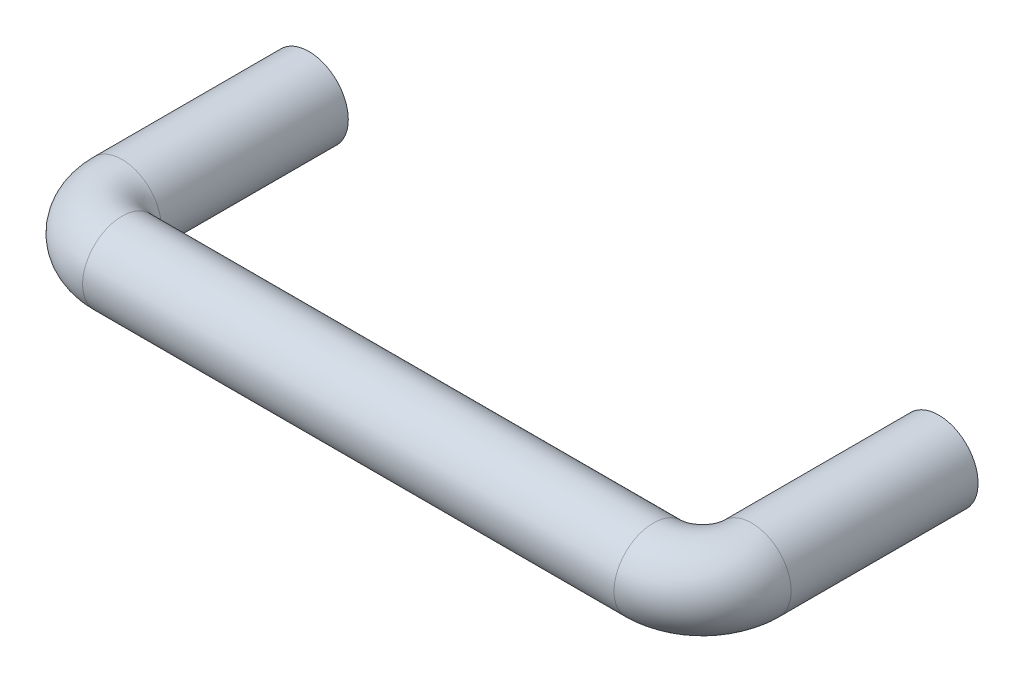
ISO-10303-21;
HEADER;
FILE_DESCRIPTION(('STEP AP214'),'2;1');
FILE_NAME('part.step','',(''),(''),'','','');
FILE_SCHEMA(('AUTOMOTIVE_DESIGN { 1 0 10303 214 1 1 1 1 }'));
ENDSEC;
DATA;
#1=APPLICATION_CONTEXT('core data for automotive mechanical design processes');
#2=APPLICATION_PROTOCOL_DEFINITION('international standard','automotive_design',2000,#1);
#3=PRODUCT_CONTEXT('',#1,'mechanical');
#4=PRODUCT('Part','Part','',(#3));
#5=PRODUCT_RELATED_PRODUCT_CATEGORY('part','',(#4));
#6=PRODUCT_DEFINITION_FORMATION('','',#4);
#7=PRODUCT_DEFINITION_CONTEXT('part definition',#1,'design');
#8=PRODUCT_DEFINITION('design','',#6,#7);
#9=PRODUCT_DEFINITION_SHAPE('','',#8);
#10=(LENGTH_UNIT() NAMED_UNIT(*) SI_UNIT(.MILLI.,.METRE.));
#11=(NAMED_UNIT(*) PLANE_ANGLE_UNIT() SI_UNIT($,.RADIAN.));
#12=(NAMED_UNIT(*) SI_UNIT($,.STERADIAN.) SOLID_ANGLE_UNIT());
#13=UNCERTAINTY_MEASURE_WITH_UNIT(LENGTH_MEASURE(1.E-05),#10,'distance_accuracy_value','');
#14=(GEOMETRIC_REPRESENTATION_CONTEXT(3) GLOBAL_UNCERTAINTY_ASSIGNED_CONTEXT((#13)) GLOBAL_UNIT_ASSIGNED_CONTEXT((#10,
#11,#12)) REPRESENTATION_CONTEXT('',''));
#15=CARTESIAN_POINT('',(0.,0.,0.));
#16=DIRECTION('',(0.,0.,1.));
#17=DIRECTION('',(1.,0.,0.));
#18=AXIS2_PLACEMENT_3D('',#15,#16,#17);
#19=CARTESIAN_POINT('',(101.6,0.,14.6812000000409));
#20=DIRECTION('',(0.,0.,-1.));
#21=DIRECTION('',(-1.,0.,0.));
#22=AXIS2_PLACEMENT_3D('',#19,#20,#21);
#23=CONICAL_SURFACE('',#22,2.55269999992916,1.02974425859277);
#24=CARTESIAN_POINT('',(101.6,0.,14.6812));
#25=DIRECTION('',(0.,0.,1.));
#26=DIRECTION('',(1.,0.,0.));
#27=AXIS2_PLACEMENT_3D('',#24,#25,#26);
#28=CIRCLE('',#27,2.5527);
#29=CARTESIAN_POINT('',(104.1527,0.,14.6812));
#30=VERTEX_POINT('',#29);
#31=EDGE_CURVE('E72',#30,#30,#28,.F.);
#32=ORIENTED_EDGE('',*,*,#31,.T.);
#33=EDGE_LOOP('',(#32));
#34=FACE_BOUND('',#33,.T.);
#35=CARTESIAN_POINT('',(101.599999999905,0.,16.2150169022652));
#36=VERTEX_POINT('',#35);
#37=VERTEX_LOOP('',#36);
#38=FACE_BOUND('',#37,.T.);
#39=ADVANCED_FACE('F16',(#34,#38),#23,.F.);
#40=CARTESIAN_POINT('',(-101.6,0.,14.6812000000978));
#41=DIRECTION('',(0.,0.,-1.));
#42=DIRECTION('',(-1.,0.,0.));
#43=AXIS2_PLACEMENT_3D('',#40,#41,#42);
#44=CONICAL_SURFACE('',#43,2.55269999989113,1.0297442585436);
#45=CARTESIAN_POINT('',(-101.6,0.,14.6812));
#46=DIRECTION('',(0.,0.,-1.));
#47=DIRECTION('',(-1.,0.,0.));
#48=AXIS2_PLACEMENT_3D('',#45,#46,#47);
#49=CIRCLE('',#48,2.5527);
#50=CARTESIAN_POINT('',(-104.1527,0.,14.6812));
#51=VERTEX_POINT('',#50);
#52=EDGE_CURVE('E69',#51,#51,#49,.T.);
#53=ORIENTED_EDGE('',*,*,#52,.T.);
#54=EDGE_LOOP('',(#53));
#55=FACE_BOUND('',#54,.T.);
#56=CARTESIAN_POINT('',(-101.599999999792,0.,16.2150169022652));
#57=VERTEX_POINT('',#56);
#58=VERTEX_LOOP('',#57);
#59=FACE_BOUND('',#58,.T.);
#60=ADVANCED_FACE('F32',(#55,#59),#44,.F.);
#61=CARTESIAN_POINT('',(101.6,0.,17.0257677473017));
#62=DIRECTION('',(0.,0.,1.));
#63=DIRECTION('',(1.,0.,0.));
#64=AXIS2_PLACEMENT_3D('',#61,#62,#63);
#65=CYLINDRICAL_SURFACE('',#64,2.5527);
#66=ORIENTED_EDGE('',*,*,#31,.F.);
#67=EDGE_LOOP('',(#66));
#68=FACE_BOUND('',#67,.T.);
#69=CARTESIAN_POINT('',(101.6,0.,0.));
#70=DIRECTION('',(0.,0.,1.));
#71=DIRECTION('',(1.,0.,0.));
#72=AXIS2_PLACEMENT_3D('',#69,#70,#71);
#73=CIRCLE('',#72,2.5527);
#74=CARTESIAN_POINT('',(104.1527,0.,0.));
#75=VERTEX_POINT('',#74);
#76=EDGE_CURVE('E19',#75,#75,#73,.T.);
#77=ORIENTED_EDGE('',*,*,#76,.F.);
#78=EDGE_LOOP('',(#77));
#79=FACE_BOUND('',#78,.T.);
#80=ADVANCED_FACE('F38',(#68,#79),#65,.F.);
#81=CARTESIAN_POINT('',(-101.6,0.,17.0257677473017));
#82=DIRECTION('',(0.,0.,-1.));
#83=DIRECTION('',(-1.,0.,0.));
#84=AXIS2_PLACEMENT_3D('',#81,#82,#83);
#85=CYLINDRICAL_SURFACE('',#84,2.5527);
#86=ORIENTED_EDGE('',*,*,#52,.F.);
#87=EDGE_LOOP('',(#86));
#88=FACE_BOUND('',#87,.T.);
#89=CARTESIAN_POINT('',(-101.6,0.,0.));
#90=DIRECTION('',(0.,0.,-1.));
#91=DIRECTION('',(-1.,0.,0.));
#92=AXIS2_PLACEMENT_3D('',#89,#90,#91);
#93=CIRCLE('',#92,2.5527);
#94=CARTESIAN_POINT('',(-104.1527,0.,0.));
#95=VERTEX_POINT('',#94);
#96=EDGE_CURVE('E78',#95,#95,#93,.T.);
#97=ORIENTED_EDGE('',*,*,#96,.T.);
#98=EDGE_LOOP('',(#97));
#99=FACE_BOUND('',#98,.T.);
#100=ADVANCED_FACE('F89',(#88,#99),#85,.F.);
#101=CARTESIAN_POINT('',(101.6,0.,0.));
#102=DIRECTION('',(0.,0.,-1.));
#103=DIRECTION('',(-1.,0.,0.));
#104=AXIS2_PLACEMENT_3D('',#101,#102,#103);
#105=PLANE('',#104);
#106=ORIENTED_EDGE('',*,*,#76,.T.);
#107=EDGE_LOOP('',(#106));
#108=FACE_BOUND('',#107,.T.);
#109=CARTESIAN_POINT('',(101.6,0.,0.));
#110=DIRECTION('',(0.,0.,-1.));
#111=DIRECTION('',(-1.,0.,0.));
#112=AXIS2_PLACEMENT_3D('',#109,#110,#111);
#113=CIRCLE('',#112,12.7);
#114=CARTESIAN_POINT('',(88.9,0.,0.));
#115=VERTEX_POINT('',#114);
#116=EDGE_CURVE('E76',#115,#115,#113,.F.);
#117=ORIENTED_EDGE('',*,*,#116,.F.);
#118=EDGE_LOOP('',(#117));
#119=FACE_BOUND('',#118,.T.);
#120=ADVANCED_FACE('F85',(#108,#119),#105,.T.);
#121=CARTESIAN_POINT('',(-101.6,0.,0.));
#122=DIRECTION('',(0.,0.,1.));
#123=DIRECTION('',(1.,0.,0.));
#124=AXIS2_PLACEMENT_3D('',#121,#122,#123);
#125=PLANE('',#124);
#126=ORIENTED_EDGE('',*,*,#96,.F.);
#127=EDGE_LOOP('',(#126));
#128=FACE_BOUND('',#127,.T.);
#129=CARTESIAN_POINT('',(-101.6,0.,0.));
#130=DIRECTION('',(0.,0.,1.));
#131=DIRECTION('',(1.,0.,0.));
#132=AXIS2_PLACEMENT_3D('',#129,#130,#131);
#133=CIRCLE('',#132,12.7);
#134=CARTESIAN_POINT('',(-88.9,0.,0.));
#135=VERTEX_POINT('',#134);
#136=EDGE_CURVE('E68',#135,#135,#133,.T.);
#137=ORIENTED_EDGE('',*,*,#136,.F.);
#138=EDGE_LOOP('',(#137));
#139=FACE_BOUND('',#138,.T.);
#140=ADVANCED_FACE('F101',(#128,#139),#125,.F.);
#141=CARTESIAN_POINT('',(101.6,0.,60.325));
#142=DIRECTION('',(0.,0.,-1.));
#143=DIRECTION('',(-1.,0.,0.));
#144=AXIS2_PLACEMENT_3D('',#141,#142,#143);
#145=CYLINDRICAL_SURFACE('',#144,12.7);
#146=ORIENTED_EDGE('',*,*,#116,.T.);
#147=EDGE_LOOP('',(#146));
#148=FACE_BOUND('',#147,.T.);
#149=CARTESIAN_POINT('',(101.6,0.,60.325));
#150=DIRECTION('',(0.,0.,-1.));
#151=DIRECTION('',(1.,0.,0.));
#152=AXIS2_PLACEMENT_3D('',#149,#150,#151);
#153=CIRCLE('',#152,12.7);
#154=CARTESIAN_POINT('',(114.3,0.,60.325));
#155=VERTEX_POINT('',#154);
#156=EDGE_CURVE('E65',#155,#155,#153,.F.);
#157=ORIENTED_EDGE('',*,*,#156,.F.);
#158=EDGE_LOOP('',(#157));
#159=FACE_BOUND('',#158,.T.);
#160=ADVANCED_FACE('F104',(#148,#159),#145,.T.);
#161=CARTESIAN_POINT('',(-101.6,0.,0.));
#162=DIRECTION('',(0.,0.,1.));
#163=DIRECTION('',(1.,0.,0.));
#164=AXIS2_PLACEMENT_3D('',#161,#162,#163);
#165=CYLINDRICAL_SURFACE('',#164,12.7);
#166=CARTESIAN_POINT('',(-101.6,0.,60.325));
#167=DIRECTION('',(0.,0.,1.));
#168=DIRECTION('',(-1.,0.,0.));
#169=AXIS2_PLACEMENT_3D('',#166,#167,#168);
#170=CIRCLE('',#169,12.7);
#171=CARTESIAN_POINT('',(-114.3,0.,60.325));
#172=VERTEX_POINT('',#171);
#173=EDGE_CURVE('E62',#172,#172,#170,.T.);
#174=ORIENTED_EDGE('',*,*,#173,.F.);
#175=EDGE_LOOP('',(#174));
#176=FACE_BOUND('',#175,.T.);
#177=ORIENTED_EDGE('',*,*,#136,.T.);
#178=EDGE_LOOP('',(#177));
#179=FACE_BOUND('',#178,.T.);
#180=ADVANCED_FACE('F107',(#176,#179),#165,.T.);
#181=CARTESIAN_POINT('',(85.725,0.,60.325));
#182=DIRECTION('',(0.,1.,0.));
#183=DIRECTION('',(0.,0.,-1.));
#184=AXIS2_PLACEMENT_3D('',#181,#182,#183);
#185=TOROIDAL_SURFACE('',#184,15.875,12.7);
#186=ORIENTED_EDGE('',*,*,#156,.T.);
#187=EDGE_LOOP('',(#186));
#188=FACE_BOUND('',#187,.T.);
#189=CARTESIAN_POINT('',(85.725,0.,76.2));
#190=DIRECTION('',(1.,0.,0.));
#191=DIRECTION('',(0.,0.,-1.));
#192=AXIS2_PLACEMENT_3D('',#189,#190,#191);
#193=CIRCLE('',#192,12.7);
#194=CARTESIAN_POINT('',(85.725,0.,63.5));
#195=VERTEX_POINT('',#194);
#196=EDGE_CURVE('E25',#195,#195,#193,.F.);
#197=ORIENTED_EDGE('',*,*,#196,.F.);
#198=EDGE_LOOP('',(#197));
#199=FACE_BOUND('',#198,.T.);
#200=ADVANCED_FACE('F49',(#188,#199),#185,.T.);
#201=CARTESIAN_POINT('',(-85.725,0.,60.325));
#202=DIRECTION('',(0.,1.,0.));
#203=DIRECTION('',(1.,0.,0.));
#204=AXIS2_PLACEMENT_3D('',#201,#202,#203);
#205=TOROIDAL_SURFACE('',#204,15.875,12.7);
#206=CARTESIAN_POINT('',(-85.725,0.,76.2));
#207=DIRECTION('',(1.,0.,0.));
#208=DIRECTION('',(0.,0.,-1.));
#209=AXIS2_PLACEMENT_3D('',#206,#207,#208);
#210=CIRCLE('',#209,12.7);
#211=CARTESIAN_POINT('',(-85.725,0.,63.5));
#212=VERTEX_POINT('',#211);
#213=EDGE_CURVE('E11',#212,#212,#210,.T.);
#214=ORIENTED_EDGE('',*,*,#213,.F.);
#215=EDGE_LOOP('',(#214));
#216=FACE_BOUND('',#215,.T.);
#217=ORIENTED_EDGE('',*,*,#173,.T.);
#218=EDGE_LOOP('',(#217));
#219=FACE_BOUND('',#218,.T.);
#220=ADVANCED_FACE('F43',(#216,#219),#205,.T.);
#221=CARTESIAN_POINT('',(-85.725,0.,76.2));
#222=DIRECTION('',(1.,0.,0.));
#223=DIRECTION('',(0.,0.,-1.));
#224=AXIS2_PLACEMENT_3D('',#221,#222,#223);
#225=CYLINDRICAL_SURFACE('',#224,12.7);
#226=ORIENTED_EDGE('',*,*,#196,.T.);
#227=EDGE_LOOP('',(#226));
#228=FACE_BOUND('',#227,.T.);
#229=ORIENTED_EDGE('',*,*,#213,.T.);
#230=EDGE_LOOP('',(#229));
#231=FACE_BOUND('',#230,.T.);
#232=ADVANCED_FACE('F41',(#228,#231),#225,.T.);
#233=CLOSED_SHELL('',(#39,#60,#80,#100,#120,#140,#160,#180,#200,#220,#232));
#234=MANIFOLD_SOLID_BREP('B1',#233);
#235=ADVANCED_BREP_SHAPE_REPRESENTATION('',(#18,#234),#14);
#236=SHAPE_DEFINITION_REPRESENTATION(#9,#235);
ENDSEC;
END-ISO-10303-21;
